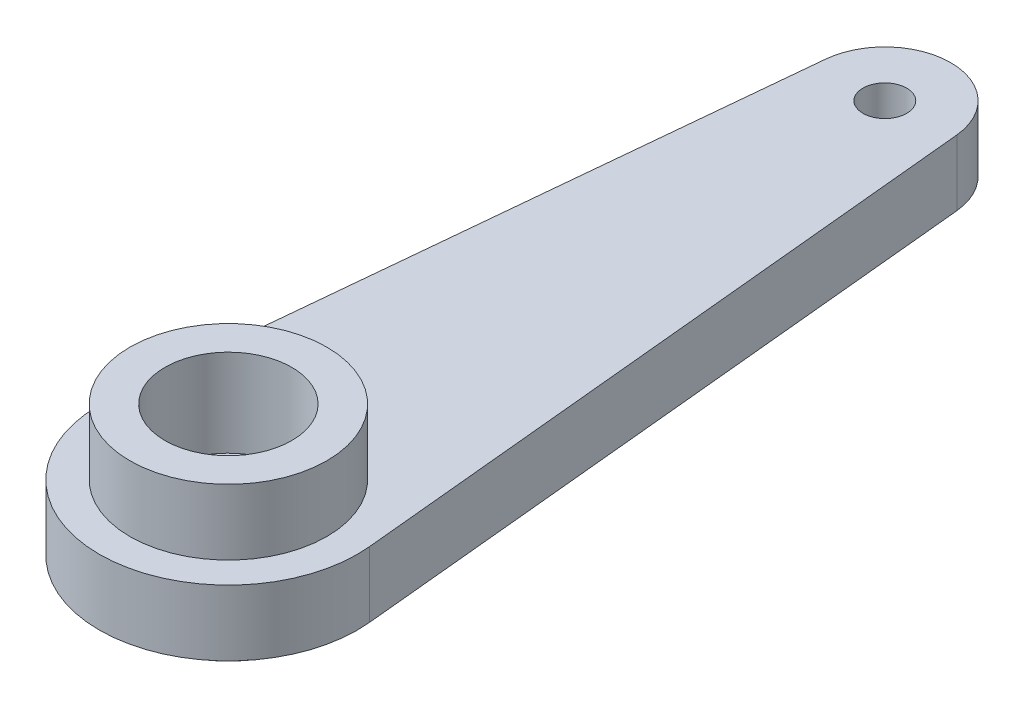
ISO-10303-21;
HEADER;
FILE_DESCRIPTION(('STEP AP214'),'2;1');
FILE_NAME('part.step','',(''),(''),'','','');
FILE_SCHEMA(('AUTOMOTIVE_DESIGN { 1 0 10303 214 1 1 1 1 }'));
ENDSEC;
DATA;
#1=APPLICATION_CONTEXT('core data for automotive mechanical design processes');
#2=APPLICATION_PROTOCOL_DEFINITION('international standard','automotive_design',2000,#1);
#3=PRODUCT_CONTEXT('',#1,'mechanical');
#4=PRODUCT('Part','Part','',(#3));
#5=PRODUCT_RELATED_PRODUCT_CATEGORY('part','',(#4));
#6=PRODUCT_DEFINITION_FORMATION('','',#4);
#7=PRODUCT_DEFINITION_CONTEXT('part definition',#1,'design');
#8=PRODUCT_DEFINITION('design','',#6,#7);
#9=PRODUCT_DEFINITION_SHAPE('','',#8);
#10=(LENGTH_UNIT() NAMED_UNIT(*) SI_UNIT(.MILLI.,.METRE.));
#11=(NAMED_UNIT(*) PLANE_ANGLE_UNIT() SI_UNIT($,.RADIAN.));
#12=(NAMED_UNIT(*) SI_UNIT($,.STERADIAN.) SOLID_ANGLE_UNIT());
#13=UNCERTAINTY_MEASURE_WITH_UNIT(LENGTH_MEASURE(1.E-05),#10,'distance_accuracy_value','');
#14=(GEOMETRIC_REPRESENTATION_CONTEXT(3) GLOBAL_UNCERTAINTY_ASSIGNED_CONTEXT((#13)) GLOBAL_UNIT_ASSIGNED_CONTEXT((#10,
#11,#12)) REPRESENTATION_CONTEXT('',''));
#15=CARTESIAN_POINT('',(0.,0.,0.));
#16=DIRECTION('',(0.,0.,1.));
#17=DIRECTION('',(1.,0.,0.));
#18=AXIS2_PLACEMENT_3D('',#15,#16,#17);
#19=CARTESIAN_POINT('',(0.,2.,0.));
#20=DIRECTION('',(0.,-1.,0.));
#21=DIRECTION('',(0.,0.,-1.));
#22=AXIS2_PLACEMENT_3D('',#19,#20,#21);
#23=CYLINDRICAL_SURFACE('',#22,1.25);
#24=CARTESIAN_POINT('',(0.,2.,0.));
#25=DIRECTION('',(0.,1.,0.));
#26=DIRECTION('',(0.,0.,1.));
#27=AXIS2_PLACEMENT_3D('',#24,#25,#26);
#28=CIRCLE('',#27,1.25);
#29=CARTESIAN_POINT('',(0.,2.,1.25));
#30=VERTEX_POINT('',#29);
#31=EDGE_CURVE('E211',#30,#30,#28,.T.);
#32=ORIENTED_EDGE('',*,*,#31,.T.);
#33=EDGE_LOOP('',(#32));
#34=FACE_BOUND('',#33,.T.);
#35=CARTESIAN_POINT('',(0.,0.5,0.));
#36=DIRECTION('',(0.,-1.,0.));
#37=DIRECTION('',(0.,0.,-1.));
#38=AXIS2_PLACEMENT_3D('',#35,#36,#37);
#39=CIRCLE('',#38,1.25);
#40=CARTESIAN_POINT('',(0.,0.5,-1.25));
#41=VERTEX_POINT('',#40);
#42=EDGE_CURVE('E135',#41,#41,#39,.T.);
#43=ORIENTED_EDGE('',*,*,#42,.T.);
#44=EDGE_LOOP('',(#43));
#45=FACE_BOUND('',#44,.T.);
#46=ADVANCED_FACE('F131',(#34,#45),#23,.F.);
#47=CARTESIAN_POINT('',(0.,3.,0.));
#48=DIRECTION('',(0.,1.,0.));
#49=DIRECTION('',(0.,0.,1.));
#50=AXIS2_PLACEMENT_3D('',#47,#48,#49);
#51=PLANE('',#50);
#52=DIRECTION('',(-0.0962007011810156,0.,0.995361956823889));
#53=VECTOR('',#52,1.);
#54=CARTESIAN_POINT('',(-5.87263554526094,3.,-0.567584136967992));
#55=LINE('',#54,#53);
#56=CARTESIAN_POINT('',(-3.,3.,-30.2899468897361));
#57=VERTEX_POINT('',#56);
#58=CARTESIAN_POINT('',(-5.87263554526095,3.,-0.567584136967978));
#59=VERTEX_POINT('',#58);
#60=EDGE_CURVE('E185',#57,#59,#55,.T.);
#61=ORIENTED_EDGE('',*,*,#60,.T.);
#62=CARTESIAN_POINT('',(0.,3.,0.));
#63=DIRECTION('',(0.,1.,0.));
#64=DIRECTION('',(0.,0.,1.));
#65=AXIS2_PLACEMENT_3D('',#62,#63,#64);
#66=CIRCLE('',#65,5.9);
#67=CARTESIAN_POINT('',(5.87263554526095,3.,-0.567584136967978));
#68=VERTEX_POINT('',#67);
#69=EDGE_CURVE('E176',#59,#68,#66,.T.);
#70=ORIENTED_EDGE('',*,*,#69,.T.);
#71=DIRECTION('',(0.0962007011810133,0.,0.995361956823889));
#72=VECTOR('',#71,1.);
#73=CARTESIAN_POINT('',(5.87263554526095,3.,-0.567584136967978));
#74=LINE('',#73,#72);
#75=CARTESIAN_POINT('',(3.00000000000004,3.,-30.2899468897364));
#76=VERTEX_POINT('',#75);
#77=EDGE_CURVE('E184',#76,#68,#74,.T.);
#78=ORIENTED_EDGE('',*,*,#77,.F.);
#79=CARTESIAN_POINT('',(0.,3.,-30.));
#80=DIRECTION('',(0.,1.,0.));
#81=DIRECTION('',(0.,0.,1.));
#82=AXIS2_PLACEMENT_3D('',#79,#80,#81);
#83=CIRCLE('',#82,3.01397896456957);
#84=EDGE_CURVE('E200',#57,#76,#83,.F.);
#85=ORIENTED_EDGE('',*,*,#84,.F.);
#86=EDGE_LOOP('',(#61,#70,#78,#85));
#87=FACE_BOUND('',#86,.T.);
#88=CARTESIAN_POINT('',(0.,3.,-30.));
#89=DIRECTION('',(0.,1.,0.));
#90=DIRECTION('',(0.,0.,1.));
#91=AXIS2_PLACEMENT_3D('',#88,#89,#90);
#92=CIRCLE('',#91,1.);
#93=CARTESIAN_POINT('',(0.,3.,-29.));
#94=VERTEX_POINT('',#93);
#95=EDGE_CURVE('E223',#94,#94,#92,.T.);
#96=ORIENTED_EDGE('',*,*,#95,.F.);
#97=EDGE_LOOP('',(#96));
#98=FACE_BOUND('',#97,.T.);
#99=CARTESIAN_POINT('',(0.,3.,0.));
#100=DIRECTION('',(0.,1.,0.));
#101=DIRECTION('',(0.,0.,1.));
#102=AXIS2_PLACEMENT_3D('',#99,#100,#101);
#103=CIRCLE('',#102,4.5);
#104=CARTESIAN_POINT('',(0.,3.,4.5));
#105=VERTEX_POINT('',#104);
#106=EDGE_CURVE('E246',#105,#105,#103,.T.);
#107=ORIENTED_EDGE('',*,*,#106,.F.);
#108=EDGE_LOOP('',(#107));
#109=FACE_BOUND('',#108,.T.);
#110=ADVANCED_FACE('F180',(#87,#98,#109),#51,.T.);
#111=CARTESIAN_POINT('',(0.,3.,0.));
#112=DIRECTION('',(0.,-1.,0.));
#113=DIRECTION('',(0.,0.,-1.));
#114=AXIS2_PLACEMENT_3D('',#111,#112,#113);
#115=CYLINDRICAL_SURFACE('',#114,2.9);
#116=CARTESIAN_POINT('',(0.,2.,0.));
#117=DIRECTION('',(0.,1.,0.));
#118=DIRECTION('',(0.,0.,1.));
#119=AXIS2_PLACEMENT_3D('',#116,#117,#118);
#120=CIRCLE('',#119,2.9);
#121=CARTESIAN_POINT('',(0.,2.,2.9));
#122=VERTEX_POINT('',#121);
#123=EDGE_CURVE('E142',#122,#122,#120,.T.);
#124=ORIENTED_EDGE('',*,*,#123,.F.);
#125=EDGE_LOOP('',(#124));
#126=FACE_BOUND('',#125,.T.);
#127=CARTESIAN_POINT('',(0.,6.,0.));
#128=DIRECTION('',(0.,1.,0.));
#129=DIRECTION('',(0.,0.,1.));
#130=AXIS2_PLACEMENT_3D('',#127,#128,#129);
#131=CIRCLE('',#130,2.9);
#132=CARTESIAN_POINT('',(0.,6.,2.9));
#133=VERTEX_POINT('',#132);
#134=EDGE_CURVE('E243',#133,#133,#131,.T.);
#135=ORIENTED_EDGE('',*,*,#134,.T.);
#136=EDGE_LOOP('',(#135));
#137=FACE_BOUND('',#136,.T.);
#138=ADVANCED_FACE('F237',(#126,#137),#115,.F.);
#139=CARTESIAN_POINT('',(0.,0.,0.));
#140=DIRECTION('',(0.,1.,0.));
#141=DIRECTION('',(0.,0.,1.));
#142=AXIS2_PLACEMENT_3D('',#139,#140,#141);
#143=PLANE('',#142);
#144=CARTESIAN_POINT('',(0.,0.,0.));
#145=DIRECTION('',(0.,1.,0.));
#146=DIRECTION('',(0.,0.,1.));
#147=AXIS2_PLACEMENT_3D('',#144,#145,#146);
#148=CIRCLE('',#147,4.5);
#149=CARTESIAN_POINT('',(0.,0.,4.5));
#150=VERTEX_POINT('',#149);
#151=EDGE_CURVE('E12',#150,#150,#148,.F.);
#152=ORIENTED_EDGE('',*,*,#151,.F.);
#153=EDGE_LOOP('',(#152));
#154=FACE_BOUND('',#153,.T.);
#155=CARTESIAN_POINT('',(0.,0.,-30.));
#156=DIRECTION('',(0.,1.,0.));
#157=DIRECTION('',(0.,0.,1.));
#158=AXIS2_PLACEMENT_3D('',#155,#156,#157);
#159=CIRCLE('',#158,1.);
#160=CARTESIAN_POINT('',(0.,0.,-29.));
#161=VERTEX_POINT('',#160);
#162=EDGE_CURVE('E206',#161,#161,#159,.T.);
#163=ORIENTED_EDGE('',*,*,#162,.T.);
#164=EDGE_LOOP('',(#163));
#165=FACE_BOUND('',#164,.T.);
#166=DIRECTION('',(-0.0962007011810156,0.,0.995361956823889));
#167=VECTOR('',#166,1.);
#168=CARTESIAN_POINT('',(-5.87263554526094,0.,-0.567584136967992));
#169=LINE('',#168,#167);
#170=CARTESIAN_POINT('',(-3.,0.,-30.2899468897361));
#171=VERTEX_POINT('',#170);
#172=CARTESIAN_POINT('',(-5.87263554526095,0.,-0.567584136967978));
#173=VERTEX_POINT('',#172);
#174=EDGE_CURVE('E210',#171,#173,#169,.T.);
#175=ORIENTED_EDGE('',*,*,#174,.F.);
#176=CARTESIAN_POINT('',(0.,0.,-30.));
#177=DIRECTION('',(0.,1.,0.));
#178=DIRECTION('',(0.,0.,1.));
#179=AXIS2_PLACEMENT_3D('',#176,#177,#178);
#180=CIRCLE('',#179,3.01397896456957);
#181=CARTESIAN_POINT('',(3.00000000000004,0.,-30.2899468897364));
#182=VERTEX_POINT('',#181);
#183=EDGE_CURVE('E219',#171,#182,#180,.F.);
#184=ORIENTED_EDGE('',*,*,#183,.T.);
#185=DIRECTION('',(0.0962007011810133,0.,0.995361956823889));
#186=VECTOR('',#185,1.);
#187=CARTESIAN_POINT('',(5.87263554526095,0.,-0.567584136967978));
#188=LINE('',#187,#186);
#189=CARTESIAN_POINT('',(5.87263554526095,0.,-0.567584136967978));
#190=VERTEX_POINT('',#189);
#191=EDGE_CURVE('E216',#182,#190,#188,.T.);
#192=ORIENTED_EDGE('',*,*,#191,.T.);
#193=CARTESIAN_POINT('',(0.,0.,0.));
#194=DIRECTION('',(0.,1.,0.));
#195=DIRECTION('',(0.,0.,1.));
#196=AXIS2_PLACEMENT_3D('',#193,#194,#195);
#197=CIRCLE('',#196,5.9);
#198=EDGE_CURVE('E192',#173,#190,#197,.T.);
#199=ORIENTED_EDGE('',*,*,#198,.F.);
#200=EDGE_LOOP('',(#175,#184,#192,#199));
#201=FACE_BOUND('',#200,.T.);
#202=ADVANCED_FACE('F240',(#154,#165,#201),#143,.F.);
#203=CARTESIAN_POINT('',(0.,3.,-30.));
#204=DIRECTION('',(0.,-1.,0.));
#205=DIRECTION('',(0.,0.,-1.));
#206=AXIS2_PLACEMENT_3D('',#203,#204,#205);
#207=CYLINDRICAL_SURFACE('',#206,1.);
#208=ORIENTED_EDGE('',*,*,#95,.T.);
#209=EDGE_LOOP('',(#208));
#210=FACE_BOUND('',#209,.T.);
#211=ORIENTED_EDGE('',*,*,#162,.F.);
#212=EDGE_LOOP('',(#211));
#213=FACE_BOUND('',#212,.T.);
#214=ADVANCED_FACE('F133',(#210,#213),#207,.F.);
#215=CARTESIAN_POINT('',(5.87263554526095,3.,-0.567584136967978));
#216=DIRECTION('',(0.995361956823889,0.,-0.0962007011810132));
#217=DIRECTION('',(-0.0962007011810133,0.,-0.995361956823889));
#218=AXIS2_PLACEMENT_3D('',#215,#216,#217);
#219=PLANE('',#218);
#220=ORIENTED_EDGE('',*,*,#191,.F.);
#221=DIRECTION('',(0.,-1.,0.));
#222=VECTOR('',#221,1.);
#223=CARTESIAN_POINT('',(3.00000000000004,3.,-30.2899468897364));
#224=LINE('',#223,#222);
#225=EDGE_CURVE('E164',#76,#182,#224,.T.);
#226=ORIENTED_EDGE('',*,*,#225,.F.);
#227=ORIENTED_EDGE('',*,*,#77,.T.);
#228=DIRECTION('',(0.,-1.,0.));
#229=VECTOR('',#228,1.);
#230=CARTESIAN_POINT('',(5.87263554526095,3.,-0.567584136967978));
#231=LINE('',#230,#229);
#232=EDGE_CURVE('E190',#68,#190,#231,.T.);
#233=ORIENTED_EDGE('',*,*,#232,.T.);
#234=EDGE_LOOP('',(#220,#226,#227,#233));
#235=FACE_BOUND('',#234,.T.);
#236=ADVANCED_FACE('F198',(#235),#219,.T.);
#237=CARTESIAN_POINT('',(0.,3.,0.));
#238=DIRECTION('',(0.,-1.,0.));
#239=DIRECTION('',(0.,0.,-1.));
#240=AXIS2_PLACEMENT_3D('',#237,#238,#239);
#241=CYLINDRICAL_SURFACE('',#240,5.9);
#242=ORIENTED_EDGE('',*,*,#198,.T.);
#243=ORIENTED_EDGE('',*,*,#232,.F.);
#244=ORIENTED_EDGE('',*,*,#69,.F.);
#245=DIRECTION('',(0.,-1.,0.));
#246=VECTOR('',#245,1.);
#247=CARTESIAN_POINT('',(-5.87263554526095,3.,-0.567584136967978));
#248=LINE('',#247,#246);
#249=EDGE_CURVE('E196',#59,#173,#248,.T.);
#250=ORIENTED_EDGE('',*,*,#249,.T.);
#251=EDGE_LOOP('',(#242,#243,#244,#250));
#252=FACE_BOUND('',#251,.T.);
#253=ADVANCED_FACE('F191',(#252),#241,.T.);
#254=CARTESIAN_POINT('',(-5.87263554526094,3.,-0.567584136967992));
#255=DIRECTION('',(0.995361956823889,0.,0.0962007011810156));
#256=DIRECTION('',(0.0962007011810156,0.,-0.995361956823889));
#257=AXIS2_PLACEMENT_3D('',#254,#255,#256);
#258=PLANE('',#257);
#259=ORIENTED_EDGE('',*,*,#174,.T.);
#260=ORIENTED_EDGE('',*,*,#249,.F.);
#261=ORIENTED_EDGE('',*,*,#60,.F.);
#262=DIRECTION('',(0.,-1.,0.));
#263=VECTOR('',#262,1.);
#264=CARTESIAN_POINT('',(-3.,3.,-30.2899468897361));
#265=LINE('',#264,#263);
#266=EDGE_CURVE('E150',#57,#171,#265,.T.);
#267=ORIENTED_EDGE('',*,*,#266,.T.);
#268=EDGE_LOOP('',(#259,#260,#261,#267));
#269=FACE_BOUND('',#268,.T.);
#270=ADVANCED_FACE('F308',(#269),#258,.F.);
#271=CARTESIAN_POINT('',(0.,3.,-30.));
#272=DIRECTION('',(0.,-1.,0.));
#273=DIRECTION('',(0.,0.,-1.));
#274=AXIS2_PLACEMENT_3D('',#271,#272,#273);
#275=CYLINDRICAL_SURFACE('',#274,3.01397896456957);
#276=ORIENTED_EDGE('',*,*,#183,.F.);
#277=ORIENTED_EDGE('',*,*,#266,.F.);
#278=ORIENTED_EDGE('',*,*,#84,.T.);
#279=ORIENTED_EDGE('',*,*,#225,.T.);
#280=EDGE_LOOP('',(#276,#277,#278,#279));
#281=FACE_BOUND('',#280,.T.);
#282=ADVANCED_FACE('F305',(#281),#275,.T.);
#283=CARTESIAN_POINT('',(0.,2.,0.));
#284=DIRECTION('',(0.,1.,0.));
#285=DIRECTION('',(0.,0.,1.));
#286=AXIS2_PLACEMENT_3D('',#283,#284,#285);
#287=PLANE('',#286);
#288=ORIENTED_EDGE('',*,*,#123,.T.);
#289=EDGE_LOOP('',(#288));
#290=FACE_BOUND('',#289,.T.);
#291=ORIENTED_EDGE('',*,*,#31,.F.);
#292=EDGE_LOOP('',(#291));
#293=FACE_BOUND('',#292,.T.);
#294=ADVANCED_FACE('F234',(#290,#293),#287,.T.);
#295=CARTESIAN_POINT('',(0.,6.,0.));
#296=DIRECTION('',(0.,1.,0.));
#297=DIRECTION('',(0.,0.,1.));
#298=AXIS2_PLACEMENT_3D('',#295,#296,#297);
#299=PLANE('',#298);
#300=CARTESIAN_POINT('',(0.,6.,0.));
#301=DIRECTION('',(0.,1.,0.));
#302=DIRECTION('',(0.,0.,1.));
#303=AXIS2_PLACEMENT_3D('',#300,#301,#302);
#304=CIRCLE('',#303,4.5);
#305=CARTESIAN_POINT('',(0.,6.,4.5));
#306=VERTEX_POINT('',#305);
#307=EDGE_CURVE('E252',#306,#306,#304,.T.);
#308=ORIENTED_EDGE('',*,*,#307,.T.);
#309=EDGE_LOOP('',(#308));
#310=FACE_BOUND('',#309,.T.);
#311=ORIENTED_EDGE('',*,*,#134,.F.);
#312=EDGE_LOOP('',(#311));
#313=FACE_BOUND('',#312,.T.);
#314=ADVANCED_FACE('F279',(#310,#313),#299,.T.);
#315=CARTESIAN_POINT('',(0.,6.,0.));
#316=DIRECTION('',(0.,-1.,0.));
#317=DIRECTION('',(0.,0.,-1.));
#318=AXIS2_PLACEMENT_3D('',#315,#316,#317);
#319=CYLINDRICAL_SURFACE('',#318,4.5);
#320=ORIENTED_EDGE('',*,*,#307,.F.);
#321=EDGE_LOOP('',(#320));
#322=FACE_BOUND('',#321,.T.);
#323=ORIENTED_EDGE('',*,*,#106,.T.);
#324=EDGE_LOOP('',(#323));
#325=FACE_BOUND('',#324,.T.);
#326=ADVANCED_FACE('F276',(#322,#325),#319,.T.);
#327=CARTESIAN_POINT('',(0.,-1.,0.));
#328=DIRECTION('',(0.,-1.,0.));
#329=DIRECTION('',(0.,0.,-1.));
#330=AXIS2_PLACEMENT_3D('',#327,#328,#329);
#331=PLANE('',#330);
#332=CARTESIAN_POINT('',(0.,-1.,0.));
#333=DIRECTION('',(0.,-1.,0.));
#334=DIRECTION('',(0.,0.,-1.));
#335=AXIS2_PLACEMENT_3D('',#332,#333,#334);
#336=CIRCLE('',#335,4.5);
#337=CARTESIAN_POINT('',(0.,-1.,-4.5));
#338=VERTEX_POINT('',#337);
#339=EDGE_CURVE('E247',#338,#338,#336,.T.);
#340=ORIENTED_EDGE('',*,*,#339,.T.);
#341=EDGE_LOOP('',(#340));
#342=FACE_BOUND('',#341,.T.);
#343=CARTESIAN_POINT('',(0.,-1.,0.));
#344=DIRECTION('',(0.,-1.,0.));
#345=DIRECTION('',(0.,0.,-1.));
#346=AXIS2_PLACEMENT_3D('',#343,#344,#345);
#347=CIRCLE('',#346,2.875);
#348=CARTESIAN_POINT('',(0.,-1.,-2.875));
#349=VERTEX_POINT('',#348);
#350=EDGE_CURVE('E255',#349,#349,#347,.T.);
#351=ORIENTED_EDGE('',*,*,#350,.F.);
#352=EDGE_LOOP('',(#351));
#353=FACE_BOUND('',#352,.T.);
#354=ADVANCED_FACE('F278',(#342,#353),#331,.T.);
#355=CARTESIAN_POINT('',(0.,-1.,0.));
#356=DIRECTION('',(0.,1.,0.));
#357=DIRECTION('',(0.,0.,1.));
#358=AXIS2_PLACEMENT_3D('',#355,#356,#357);
#359=CYLINDRICAL_SURFACE('',#358,4.5);
#360=ORIENTED_EDGE('',*,*,#339,.F.);
#361=EDGE_LOOP('',(#360));
#362=FACE_BOUND('',#361,.T.);
#363=ORIENTED_EDGE('',*,*,#151,.T.);
#364=EDGE_LOOP('',(#363));
#365=FACE_BOUND('',#364,.T.);
#366=ADVANCED_FACE('F287',(#362,#365),#359,.T.);
#367=CARTESIAN_POINT('',(0.,-1.,0.));
#368=DIRECTION('',(0.,1.,0.));
#369=DIRECTION('',(0.,0.,1.));
#370=AXIS2_PLACEMENT_3D('',#367,#368,#369);
#371=CYLINDRICAL_SURFACE('',#370,2.875);
#372=ORIENTED_EDGE('',*,*,#350,.T.);
#373=EDGE_LOOP('',(#372));
#374=FACE_BOUND('',#373,.T.);
#375=CARTESIAN_POINT('',(0.,0.5,0.));
#376=DIRECTION('',(0.,-1.,0.));
#377=DIRECTION('',(0.,0.,-1.));
#378=AXIS2_PLACEMENT_3D('',#375,#376,#377);
#379=CIRCLE('',#378,2.875);
#380=CARTESIAN_POINT('',(0.,0.5,-2.875));
#381=VERTEX_POINT('',#380);
#382=EDGE_CURVE('E398',#381,#381,#379,.T.);
#383=ORIENTED_EDGE('',*,*,#382,.F.);
#384=EDGE_LOOP('',(#383));
#385=FACE_BOUND('',#384,.T.);
#386=ADVANCED_FACE('F364',(#374,#385),#371,.F.);
#387=CARTESIAN_POINT('',(0.,0.5,0.));
#388=DIRECTION('',(0.,-1.,0.));
#389=DIRECTION('',(0.,0.,-1.));
#390=AXIS2_PLACEMENT_3D('',#387,#388,#389);
#391=PLANE('',#390);
#392=ORIENTED_EDGE('',*,*,#42,.F.);
#393=EDGE_LOOP('',(#392));
#394=FACE_BOUND('',#393,.T.);
#395=ORIENTED_EDGE('',*,*,#382,.T.);
#396=EDGE_LOOP('',(#395));
#397=FACE_BOUND('',#396,.T.);
#398=ADVANCED_FACE('F374',(#394,#397),#391,.T.);
#399=CLOSED_SHELL('',(#46,#110,#138,#202,#214,#236,#253,#270,#282,#294,#314,#326,#354,#366,#386,#398));
#400=MANIFOLD_SOLID_BREP('B2',#399);
#401=ADVANCED_BREP_SHAPE_REPRESENTATION('',(#18,#400),#14);
#402=SHAPE_DEFINITION_REPRESENTATION(#9,#401);
ENDSEC;
END-ISO-10303-21;
